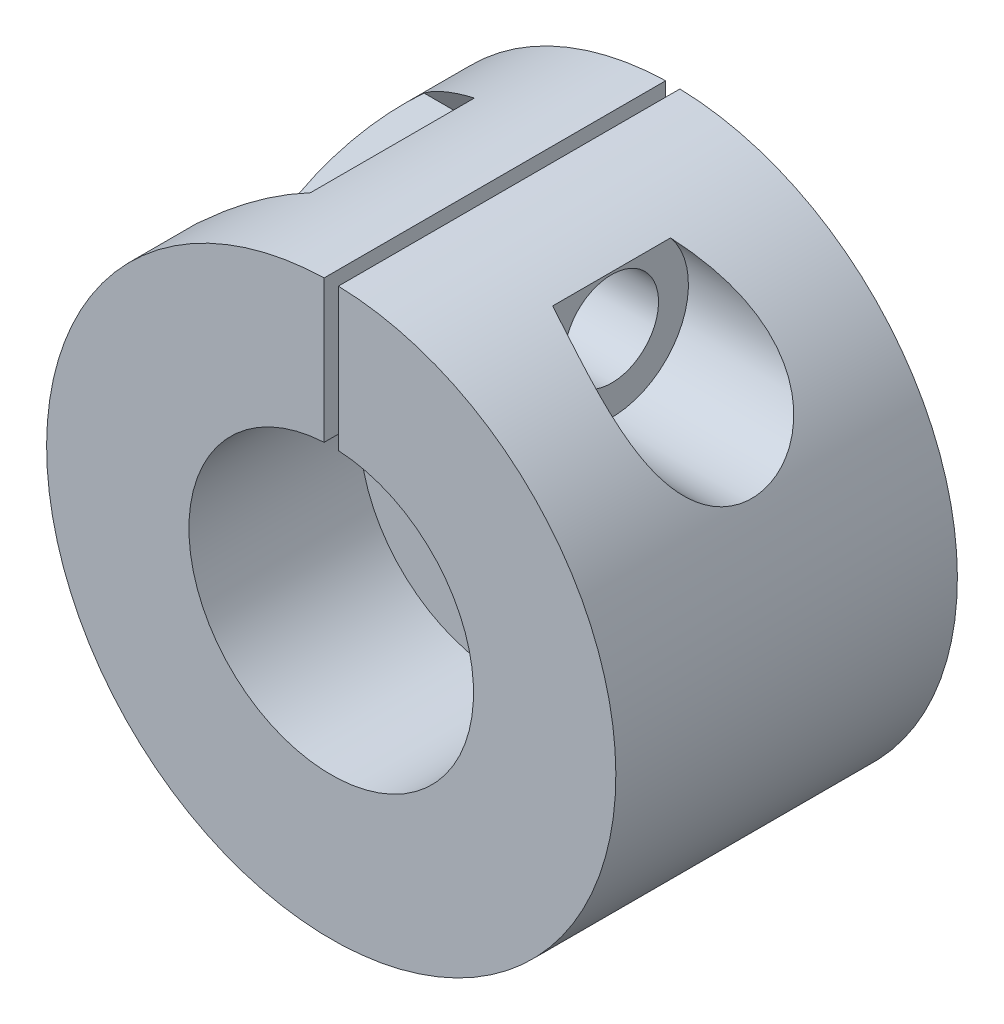
ISO-10303-21;
HEADER;
FILE_DESCRIPTION(('STEP AP214'),'2;1');
FILE_NAME('part.step','',(''),(''),'','','');
FILE_SCHEMA(('AUTOMOTIVE_DESIGN { 1 0 10303 214 1 1 1 1 }'));
ENDSEC;
DATA;
#1=APPLICATION_CONTEXT('core data for automotive mechanical design processes');
#2=APPLICATION_PROTOCOL_DEFINITION('international standard','automotive_design',2000,#1);
#3=PRODUCT_CONTEXT('',#1,'mechanical');
#4=PRODUCT('Part','Part','',(#3));
#5=PRODUCT_RELATED_PRODUCT_CATEGORY('part','',(#4));
#6=PRODUCT_DEFINITION_FORMATION('','',#4);
#7=PRODUCT_DEFINITION_CONTEXT('part definition',#1,'design');
#8=PRODUCT_DEFINITION('design','',#6,#7);
#9=PRODUCT_DEFINITION_SHAPE('','',#8);
#10=(LENGTH_UNIT() NAMED_UNIT(*) SI_UNIT(.MILLI.,.METRE.));
#11=(NAMED_UNIT(*) PLANE_ANGLE_UNIT() SI_UNIT($,.RADIAN.));
#12=(NAMED_UNIT(*) SI_UNIT($,.STERADIAN.) SOLID_ANGLE_UNIT());
#13=UNCERTAINTY_MEASURE_WITH_UNIT(LENGTH_MEASURE(1.E-05),#10,'distance_accuracy_value','');
#14=(GEOMETRIC_REPRESENTATION_CONTEXT(3) GLOBAL_UNCERTAINTY_ASSIGNED_CONTEXT((#13)) GLOBAL_UNIT_ASSIGNED_CONTEXT((#10,
#11,#12)) REPRESENTATION_CONTEXT('',''));
#15=CARTESIAN_POINT('',(0.,0.,0.));
#16=DIRECTION('',(0.,0.,1.));
#17=DIRECTION('',(1.,0.,0.));
#18=AXIS2_PLACEMENT_3D('',#15,#16,#17);
#19=CARTESIAN_POINT('',(0.,0.,15.24));
#20=DIRECTION('',(0.,0.,-1.));
#21=DIRECTION('',(-1.,0.,0.));
#22=AXIS2_PLACEMENT_3D('',#19,#20,#21);
#23=CYLINDRICAL_SURFACE('',#22,12.7);
#24=DIRECTION('',(0.,0.,-1.));
#25=VECTOR('',#24,1.);
#26=CARTESIAN_POINT('',(-11.5623208619439,5.25383062968895,15.24));
#27=LINE('',#26,#25);
#28=CARTESIAN_POINT('',(-11.5623208619439,5.25383062968895,10.083669068686));
#29=VERTEX_POINT('',#28);
#30=CARTESIAN_POINT('',(-11.5623208619439,5.25383062968895,5.15633093131403));
#31=VERTEX_POINT('',#30);
#32=EDGE_CURVE('E48',#29,#31,#27,.T.);
#33=ORIENTED_EDGE('',*,*,#32,.T.);
#34=CARTESIAN_POINT('',(0.,0.,8.18963145964165));
#35=DIRECTION('',(0.,-0.5,-0.866025403784438));
#36=DIRECTION('',(0.,0.866025403784439,-0.5));
#37=AXIS2_PLACEMENT_3D('',#34,#35,#36);
#38=ELLIPSE('',#37,14.6646968374165,12.7);
#39=CARTESIAN_POINT('',(-8.40475911305761,9.52103062968895,2.69266186262806));
#40=VERTEX_POINT('',#39);
#41=EDGE_CURVE('E11',#31,#40,#38,.T.);
#42=ORIENTED_EDGE('',*,*,#41,.T.);
#43=CARTESIAN_POINT('',(0.,0.,-2.80430773438554));
#44=DIRECTION('',(0.,0.5,-0.866025403784438));
#45=DIRECTION('',(0.,-0.866025403784439,-0.5));
#46=AXIS2_PLACEMENT_3D('',#43,#44,#45);
#47=ELLIPSE('',#46,14.6646968374165,12.7);
#48=CARTESIAN_POINT('',(-4.8895,11.7210404721595,3.96283813739823));
#49=VERTEX_POINT('',#48);
#50=EDGE_CURVE('E135',#40,#49,#47,.T.);
#51=ORIENTED_EDGE('',*,*,#50,.T.);
#52=DIRECTION('',(0.,0.,-1.));
#53=VECTOR('',#52,1.);
#54=CARTESIAN_POINT('',(-4.8895,11.7210404721595,15.24));
#55=LINE('',#54,#53);
#56=CARTESIAN_POINT('',(-4.8895,11.7210404721595,11.2771618626018));
#57=VERTEX_POINT('',#56);
#58=EDGE_CURVE('E148',#49,#57,#55,.F.);
#59=ORIENTED_EDGE('',*,*,#58,.T.);
#60=CARTESIAN_POINT('',(0.,0.,18.0443077343855));
#61=DIRECTION('',(0.,0.5,0.866025403784438));
#62=DIRECTION('',(0.,0.866025403784439,-0.5));
#63=AXIS2_PLACEMENT_3D('',#60,#61,#62);
#64=ELLIPSE('',#63,14.6646968374165,12.7);
#65=CARTESIAN_POINT('',(-8.40475911305761,9.52103062968895,12.5473381373719));
#66=VERTEX_POINT('',#65);
#67=EDGE_CURVE('E367',#57,#66,#64,.T.);
#68=ORIENTED_EDGE('',*,*,#67,.T.);
#69=CARTESIAN_POINT('',(0.,0.,7.05036854035835));
#70=DIRECTION('',(0.,-0.5,0.866025403784438));
#71=DIRECTION('',(0.,-0.866025403784438,-0.5));
#72=AXIS2_PLACEMENT_3D('',#69,#70,#71);
#73=ELLIPSE('',#72,14.6646968374165,12.7);
#74=EDGE_CURVE('E370',#66,#29,#73,.T.);
#75=ORIENTED_EDGE('',*,*,#74,.T.);
#76=EDGE_LOOP('',(#33,#42,#51,#59,#68,#75));
#77=FACE_BOUND('',#76,.T.);
#78=DIRECTION('',(0.,0.,-1.));
#79=VECTOR('',#78,1.);
#80=CARTESIAN_POINT('',(4.8895,11.7210404721595,15.24));
#81=LINE('',#80,#79);
#82=CARTESIAN_POINT('',(4.8895,11.7210404721595,10.2502086786095));
#83=VERTEX_POINT('',#82);
#84=CARTESIAN_POINT('',(4.8895,11.7210404721595,4.98979132139046));
#85=VERTEX_POINT('',#84);
#86=EDGE_CURVE('E178',#83,#85,#81,.T.);
#87=ORIENTED_EDGE('',*,*,#86,.T.);
#88=CARTESIAN_POINT('',(4.8895,11.7210404721595,4.98979132139047));
#89=CARTESIAN_POINT('',(5.14238159479776,11.6155378420201,4.90157651494984));
#90=CARTESIAN_POINT('',(5.39308389032257,11.5013576712272,4.81684363667059));
#91=CARTESIAN_POINT('',(5.89014783145619,11.2549312086779,4.65803034717835));
#92=CARTESIAN_POINT('',(6.13648979791708,11.1226191174049,4.58399084950643));
#93=CARTESIAN_POINT('',(6.62642102503,10.8379847556756,4.45002189206422));
#94=CARTESIAN_POINT('',(6.86992086999459,10.6854039307741,4.3903088117292));
#95=CARTESIAN_POINT('',(7.34852553657174,10.3620610580789,4.29145057329817));
#96=CARTESIAN_POINT('',(7.58364417036977,10.1913309639781,4.25226996405209));
#97=CARTESIAN_POINT('',(7.93303525523491,9.91866961084558,4.21283123604913));
#98=CARTESIAN_POINT('',(8.05117565176498,9.82302109285119,4.20291795176991));
#99=CARTESIAN_POINT('',(8.28420763722012,9.62730673984792,4.19124518152161));
#100=CARTESIAN_POINT('',(8.39909903774156,9.52724064952992,4.18948616744476));
#101=CARTESIAN_POINT('',(8.62466963831202,9.32352327037322,4.1951823688543));
#102=CARTESIAN_POINT('',(8.73536292737595,9.21988671553529,4.20260330559498));
#103=CARTESIAN_POINT('',(8.95237309490112,9.0093204644907,4.22773941609644));
#104=CARTESIAN_POINT('',(9.05869077192099,8.90239137546174,4.24545270248012));
#105=CARTESIAN_POINT('',(9.2491890571501,8.70391828328022,4.2884968273324));
#106=CARTESIAN_POINT('',(9.3341356468588,8.61273477705542,4.3120967368714));
#107=CARTESIAN_POINT('',(9.50002182747443,8.42940453214513,4.36798891961584));
#108=CARTESIAN_POINT('',(9.5809623025272,8.3372580114823,4.40027926463137));
#109=CARTESIAN_POINT('',(9.73833696283624,8.15288073587676,4.47419990036315));
#110=CARTESIAN_POINT('',(9.81477272774282,8.06065002211803,4.51582689212573));
#111=CARTESIAN_POINT('',(9.96260730555212,7.8772055112651,4.60894042197619));
#112=CARTESIAN_POINT('',(10.0340072298087,7.78599149356223,4.66042477527917));
#113=CARTESIAN_POINT('',(10.2125699138797,7.55156361165428,4.80785021391288));
#114=CARTESIAN_POINT('',(10.3154751470015,7.40999984177046,4.91192706359034));
#115=CARTESIAN_POINT('',(10.4575115434693,7.20675956738354,5.08814769687737));
#116=CARTESIAN_POINT('',(10.5028188207455,7.14050611676664,5.15026718305753));
#117=CARTESIAN_POINT('',(10.5891429070966,7.01184882861304,5.28110139218578));
#118=CARTESIAN_POINT('',(10.6301617985014,6.9494431288037,5.34981288285088));
#119=CARTESIAN_POINT('',(10.7079853069349,6.82892682159748,5.49408449495294));
#120=CARTESIAN_POINT('',(10.7447590136293,6.77084869089552,5.56968845107599));
#121=CARTESIAN_POINT('',(10.8135938455054,6.6603620514393,5.72689672421234));
#122=CARTESIAN_POINT('',(10.8456571332917,6.60795094382916,5.80849826169067));
#123=CARTESIAN_POINT('',(10.904969348353,6.50960399814713,5.9771727303747));
#124=CARTESIAN_POINT('',(10.9322184321144,6.46366794961206,6.06424548361276));
#125=CARTESIAN_POINT('',(10.9818205353506,6.37903021447655,6.24316841987484));
#126=CARTESIAN_POINT('',(11.0041741342385,6.34032767182214,6.33501803593126));
#127=CARTESIAN_POINT('',(11.041744194892,6.27464377137506,6.51232619544949));
#128=CARTESIAN_POINT('',(11.0574759097581,6.24684045037194,6.59737233184051));
#129=CARTESIAN_POINT('',(11.0850155954977,6.19783993691063,6.77000126936382));
#130=CARTESIAN_POINT('',(11.0968222698994,6.17664492737329,6.85758489828552));
#131=CARTESIAN_POINT('',(11.1164883942662,6.14118074940907,7.03452050619283));
#132=CARTESIAN_POINT('',(11.1243506281873,6.12690669646313,7.12387119157595));
#133=CARTESIAN_POINT('',(11.1361411020666,6.10544826571359,7.3036854824399));
#134=CARTESIAN_POINT('',(11.1400679333319,6.09826642660956,7.39414947471233));
#135=CARTESIAN_POINT('',(11.1457036234476,6.0879752617976,7.65550952413232));
#136=CARTESIAN_POINT('',(11.142404132655,6.0940399148083,7.8269957269253));
#137=CARTESIAN_POINT('',(11.1218272436794,6.13150716150028,8.16619639821076));
#138=CARTESIAN_POINT('',(11.1045520734253,6.16290571658247,8.33391146349849));
#139=CARTESIAN_POINT('',(11.0562321567457,6.24917077151799,8.65978966589859));
#140=CARTESIAN_POINT('',(11.0252877526868,6.30386615254241,8.81801303818298));
#141=CARTESIAN_POINT('',(10.949790343869,6.43410632051461,9.12210336225755));
#142=CARTESIAN_POINT('',(10.9052367170642,6.50965206046846,9.26796974884935));
#143=CARTESIAN_POINT('',(10.8012083357712,6.68088435009802,9.54859961111896));
#144=CARTESIAN_POINT('',(10.7412963098073,6.77714491408201,9.68284920657144));
#145=CARTESIAN_POINT('',(10.6080615726868,6.98384771218797,9.93236257276186));
#146=CARTESIAN_POINT('',(10.5347356620145,7.09429332788988,10.0476218013737));
#147=CARTESIAN_POINT('',(10.3689004937249,7.33477917301391,10.2670879181629));
#148=CARTESIAN_POINT('',(10.2752853264894,7.46568753765836,10.3694990577714));
#149=CARTESIAN_POINT('',(10.0750987581429,7.73371599007902,10.5508306510212));
#150=CARTESIAN_POINT('',(9.96851963233054,7.87083975053174,10.6297370015812));
#151=CARTESIAN_POINT('',(9.77430909297078,8.10986494180957,10.7471952499465));
#152=CARTESIAN_POINT('',(9.68923183957235,8.21138001936601,10.7908959028506));
#153=CARTESIAN_POINT('',(9.51376712855669,8.41404721184828,10.8672069301116));
#154=CARTESIAN_POINT('',(9.42337773299305,8.51519917984714,10.8998132272624));
#155=CARTESIAN_POINT('',(9.23785848797224,8.71611715855861,10.9548195560698));
#156=CARTESIAN_POINT('',(9.14272296136255,8.815881317608,10.9772070230622));
#157=CARTESIAN_POINT('',(8.94837566032418,9.01308810493386,11.0126501752606));
#158=CARTESIAN_POINT('',(8.84916267518507,9.11053002990626,11.0257030672915));
#159=CARTESIAN_POINT('',(8.60327507022835,9.3441728715736,11.0472269510711));
#160=CARTESIAN_POINT('',(8.45471571344509,9.47881031114163,11.051240014344));
#161=CARTESIAN_POINT('',(8.1515718417328,9.74074258912694,11.0444627748009));
#162=CARTESIAN_POINT('',(7.99698448307468,9.86803389000661,11.0336654009814));
#163=CARTESIAN_POINT('',(7.68232777508925,10.1149380509837,10.9994819737951));
#164=CARTESIAN_POINT('',(7.52224151414851,10.2345232173586,10.9760530745343));
#165=CARTESIAN_POINT('',(7.19794920423795,10.4651382584145,10.9186088645083));
#166=CARTESIAN_POINT('',(7.03374389581494,10.5761696565351,10.8845954443262));
#167=CARTESIAN_POINT('',(6.70754174726278,10.7858788059942,10.8090731806906));
#168=CARTESIAN_POINT('',(6.54566343356883,10.884850227904,10.7678626287065));
#169=CARTESIAN_POINT('',(6.2190520947139,11.0747043550815,10.6786175901254));
#170=CARTESIAN_POINT('',(6.05431863049795,11.1655858028775,10.630582045682));
#171=CARTESIAN_POINT('',(5.72411778973097,11.3383791624212,10.5295013871728));
#172=CARTESIAN_POINT('',(5.55867666601376,11.4203758796445,10.4765147203313));
#173=CARTESIAN_POINT('',(5.22566060438949,11.5765384717977,10.3662793179787));
#174=CARTESIAN_POINT('',(5.05808701362243,11.6507090398854,10.3090331723069));
#175=CARTESIAN_POINT('',(4.8895,11.7210404721595,10.2502086786095));
#176=B_SPLINE_CURVE_WITH_KNOTS('',3,(#88,#89,#90,#91,#92,#93,#94,#95,#96,#97,#98,#99,#100,#101,
#102,#103,#104,#105,#106,#107,#108,#109,#110,#111,#112,#113,#114,#115,#116,#117,#118,#119,#120,
#121,#122,#123,#124,#125,#126,#127,#128,#129,#130,#131,#132,#133,#134,#135,#136,#137,#138,#139,
#140,#141,#142,#143,#144,#145,#146,#147,#148,#149,#150,#151,#152,#153,#154,#155,#156,#157,#158,
#159,#160,#161,#162,#163,#164,#165,#166,#167,#168,#169,#170,#171,#172,#173,#174,#175),
.UNSPECIFIED.,.F.,.F.,(4,2,2,2,2,2,2,2,2,2,2,2,2,2,2,2,2,2,2,2,2,2,2,2,2,2,2,2,2,2,2,2,2,2,2,2,
2,2,2,2,2,2,2,4),(0.,0.863719340341155,1.73066042721221,2.60997021523415,3.48775675205787,
3.94448310042033,4.40123587946431,4.85628823987739,5.31125718061348,5.69143396625997,
6.07152646964346,6.45148488444192,6.83135918256839,7.43924368596816,7.74342522029639,
8.04745835909528,8.35358162484506,8.65956390387656,8.96553623506674,9.27147233280182,
9.54366606811699,9.81594962205034,10.0880407290126,10.3602291973171,10.8724081674794,
11.3845055048587,11.8929045679958,12.4013268723469,12.9262473098371,13.4512931163897,
14.021370153646,14.5917885563649,15.0096759275764,15.4277167080824,15.8462701192805,
16.2649487214287,16.8656176750867,17.4665735082583,18.0695807160389,18.6724802778039,
19.2546279101856,19.8368658717298,20.4129370843937,20.988660853491),.UNSPECIFIED.);
#177=EDGE_CURVE('E246',#85,#83,#176,.T.);
#178=ORIENTED_EDGE('',*,*,#177,.T.);
#179=EDGE_LOOP('',(#87,#178));
#180=FACE_BOUND('',#179,.T.);
#181=CARTESIAN_POINT('',(0.,0.,15.24));
#182=DIRECTION('',(0.,0.,1.));
#183=DIRECTION('',(1.,0.,0.));
#184=AXIS2_PLACEMENT_3D('',#181,#182,#183);
#185=CIRCLE('',#184,12.7);
#186=CARTESIAN_POINT('',(-0.3175,12.6960306296889,15.24));
#187=VERTEX_POINT('',#186);
#188=CARTESIAN_POINT('',(0.3175,12.6960306296889,15.24));
#189=VERTEX_POINT('',#188);
#190=EDGE_CURVE('E242',#187,#189,#185,.T.);
#191=ORIENTED_EDGE('',*,*,#190,.F.);
#192=DIRECTION('',(0.,0.,-1.));
#193=VECTOR('',#192,1.);
#194=CARTESIAN_POINT('',(-0.3175,12.6960306296889,15.24));
#195=LINE('',#194,#193);
#196=CARTESIAN_POINT('',(-0.3175,12.6960306296889,0.));
#197=VERTEX_POINT('',#196);
#198=EDGE_CURVE('E196',#197,#187,#195,.F.);
#199=ORIENTED_EDGE('',*,*,#198,.F.);
#200=CARTESIAN_POINT('',(0.,0.,0.));
#201=DIRECTION('',(0.,0.,1.));
#202=DIRECTION('',(1.,0.,0.));
#203=AXIS2_PLACEMENT_3D('',#200,#201,#202);
#204=CIRCLE('',#203,12.7);
#205=CARTESIAN_POINT('',(0.3175,12.6960306296889,0.));
#206=VERTEX_POINT('',#205);
#207=EDGE_CURVE('E241',#197,#206,#204,.T.);
#208=ORIENTED_EDGE('',*,*,#207,.T.);
#209=DIRECTION('',(0.,0.,-1.));
#210=VECTOR('',#209,1.);
#211=CARTESIAN_POINT('',(0.3175,12.6960306296889,15.24));
#212=LINE('',#211,#210);
#213=EDGE_CURVE('E193',#189,#206,#212,.T.);
#214=ORIENTED_EDGE('',*,*,#213,.F.);
#215=EDGE_LOOP('',(#191,#199,#208,#214));
#216=FACE_BOUND('',#215,.T.);
#217=ADVANCED_FACE('F39',(#77,#180,#216),#23,.T.);
#218=CARTESIAN_POINT('',(0.,0.,15.24));
#219=DIRECTION('',(0.,0.,1.));
#220=DIRECTION('',(1.,0.,0.));
#221=AXIS2_PLACEMENT_3D('',#218,#219,#220);
#222=PLANE('',#221);
#223=DIRECTION('',(0.,1.,0.));
#224=VECTOR('',#223,1.);
#225=CARTESIAN_POINT('',(-0.3175,-0.635000000000001,15.24));
#226=LINE('',#225,#224);
#227=CARTESIAN_POINT('',(-0.3175,6.34205753285162,15.24));
#228=VERTEX_POINT('',#227);
#229=EDGE_CURVE('E205',#228,#187,#226,.T.);
#230=ORIENTED_EDGE('',*,*,#229,.T.);
#231=ORIENTED_EDGE('',*,*,#190,.T.);
#232=DIRECTION('',(0.,-1.,0.));
#233=VECTOR('',#232,1.);
#234=CARTESIAN_POINT('',(0.3175,-0.635000000000001,15.24));
#235=LINE('',#234,#233);
#236=CARTESIAN_POINT('',(0.3175,6.34205753285162,15.24));
#237=VERTEX_POINT('',#236);
#238=EDGE_CURVE('E221',#189,#237,#235,.T.);
#239=ORIENTED_EDGE('',*,*,#238,.T.);
#240=CARTESIAN_POINT('',(0.,0.,15.24));
#241=DIRECTION('',(0.,0.,1.));
#242=DIRECTION('',(1.,0.,0.));
#243=AXIS2_PLACEMENT_3D('',#240,#241,#242);
#244=CIRCLE('',#243,6.35);
#245=EDGE_CURVE('E225',#228,#237,#244,.T.);
#246=ORIENTED_EDGE('',*,*,#245,.F.);
#247=EDGE_LOOP('',(#230,#231,#239,#246));
#248=FACE_BOUND('',#247,.T.);
#249=ADVANCED_FACE('F299',(#248),#222,.T.);
#250=CARTESIAN_POINT('',(0.,0.,0.));
#251=DIRECTION('',(0.,0.,1.));
#252=DIRECTION('',(1.,0.,0.));
#253=AXIS2_PLACEMENT_3D('',#250,#251,#252);
#254=PLANE('',#253);
#255=ORIENTED_EDGE('',*,*,#207,.F.);
#256=DIRECTION('',(0.,1.,0.));
#257=VECTOR('',#256,1.);
#258=CARTESIAN_POINT('',(-0.3175,-0.635000000000001,0.));
#259=LINE('',#258,#257);
#260=CARTESIAN_POINT('',(-0.3175,2.96756364716917,0.));
#261=VERTEX_POINT('',#260);
#262=EDGE_CURVE('E209',#261,#197,#259,.T.);
#263=ORIENTED_EDGE('',*,*,#262,.F.);
#264=CARTESIAN_POINT('',(0.,0.,0.));
#265=DIRECTION('',(0.,0.,-1.));
#266=DIRECTION('',(-1.,0.,0.));
#267=AXIS2_PLACEMENT_3D('',#264,#265,#266);
#268=CIRCLE('',#267,2.9845);
#269=CARTESIAN_POINT('',(0.3175,2.96756364716917,0.));
#270=VERTEX_POINT('',#269);
#271=EDGE_CURVE('E237',#270,#261,#268,.T.);
#272=ORIENTED_EDGE('',*,*,#271,.F.);
#273=DIRECTION('',(0.,-1.,0.));
#274=VECTOR('',#273,1.);
#275=CARTESIAN_POINT('',(0.3175,-0.635000000000001,0.));
#276=LINE('',#275,#274);
#277=EDGE_CURVE('E212',#206,#270,#276,.T.);
#278=ORIENTED_EDGE('',*,*,#277,.F.);
#279=EDGE_LOOP('',(#255,#263,#272,#278));
#280=FACE_BOUND('',#279,.T.);
#281=ADVANCED_FACE('F297',(#280),#254,.F.);
#282=CARTESIAN_POINT('',(0.,0.,7.62));
#283=DIRECTION('',(0.,0.,-1.));
#284=DIRECTION('',(-1.,0.,0.));
#285=AXIS2_PLACEMENT_3D('',#282,#283,#284);
#286=CYLINDRICAL_SURFACE('',#285,2.9845);
#287=ORIENTED_EDGE('',*,*,#271,.T.);
#288=DIRECTION('',(0.,0.,-1.));
#289=VECTOR('',#288,1.);
#290=CARTESIAN_POINT('',(-0.3175,2.96756364716917,7.62));
#291=LINE('',#290,#289);
#292=CARTESIAN_POINT('',(-0.3175,2.96756364716917,7.62));
#293=VERTEX_POINT('',#292);
#294=EDGE_CURVE('E190',#293,#261,#291,.T.);
#295=ORIENTED_EDGE('',*,*,#294,.F.);
#296=CARTESIAN_POINT('',(0.,0.,7.62));
#297=DIRECTION('',(0.,0.,-1.));
#298=DIRECTION('',(-1.,0.,0.));
#299=AXIS2_PLACEMENT_3D('',#296,#297,#298);
#300=CIRCLE('',#299,2.9845);
#301=CARTESIAN_POINT('',(0.3175,2.96756364716917,7.62));
#302=VERTEX_POINT('',#301);
#303=EDGE_CURVE('E233',#302,#293,#300,.T.);
#304=ORIENTED_EDGE('',*,*,#303,.F.);
#305=DIRECTION('',(0.,0.,-1.));
#306=VECTOR('',#305,1.);
#307=CARTESIAN_POINT('',(0.3175,2.96756364716917,7.62));
#308=LINE('',#307,#306);
#309=EDGE_CURVE('E187',#270,#302,#308,.F.);
#310=ORIENTED_EDGE('',*,*,#309,.F.);
#311=EDGE_LOOP('',(#287,#295,#304,#310));
#312=FACE_BOUND('',#311,.T.);
#313=ADVANCED_FACE('F293',(#312),#286,.F.);
#314=CARTESIAN_POINT('',(0.,0.,7.62));
#315=DIRECTION('',(0.,0.,-1.));
#316=DIRECTION('',(-1.,0.,0.));
#317=AXIS2_PLACEMENT_3D('',#314,#315,#316);
#318=PLANE('',#317);
#319=ORIENTED_EDGE('',*,*,#303,.T.);
#320=DIRECTION('',(0.,-1.,0.));
#321=VECTOR('',#320,1.);
#322=CARTESIAN_POINT('',(-0.3175,-0.635000000000001,7.62));
#323=LINE('',#322,#321);
#324=CARTESIAN_POINT('',(-0.3175,6.34205753285162,7.62));
#325=VERTEX_POINT('',#324);
#326=EDGE_CURVE('E202',#325,#293,#323,.T.);
#327=ORIENTED_EDGE('',*,*,#326,.F.);
#328=CARTESIAN_POINT('',(0.,0.,7.62));
#329=DIRECTION('',(0.,0.,-1.));
#330=DIRECTION('',(-1.,0.,0.));
#331=AXIS2_PLACEMENT_3D('',#328,#329,#330);
#332=CIRCLE('',#331,6.35);
#333=CARTESIAN_POINT('',(0.3175,6.34205753285162,7.62));
#334=VERTEX_POINT('',#333);
#335=EDGE_CURVE('E229',#325,#334,#332,.F.);
#336=ORIENTED_EDGE('',*,*,#335,.T.);
#337=DIRECTION('',(0.,1.,0.));
#338=VECTOR('',#337,1.);
#339=CARTESIAN_POINT('',(0.3175,-0.635000000000001,7.62));
#340=LINE('',#339,#338);
#341=EDGE_CURVE('E218',#302,#334,#340,.T.);
#342=ORIENTED_EDGE('',*,*,#341,.F.);
#343=EDGE_LOOP('',(#319,#327,#336,#342));
#344=FACE_BOUND('',#343,.T.);
#345=ADVANCED_FACE('F289',(#344),#318,.F.);
#346=CARTESIAN_POINT('',(0.,0.,-10.3405122421383));
#347=DIRECTION('',(0.,0.,1.));
#348=DIRECTION('',(1.,0.,0.));
#349=AXIS2_PLACEMENT_3D('',#346,#347,#348);
#350=CYLINDRICAL_SURFACE('',#349,6.35);
#351=ORIENTED_EDGE('',*,*,#335,.F.);
#352=DIRECTION('',(0.,0.,1.));
#353=VECTOR('',#352,1.);
#354=CARTESIAN_POINT('',(-0.3175,6.34205753285162,-10.3405122421383));
#355=LINE('',#354,#353);
#356=EDGE_CURVE('E199',#228,#325,#355,.F.);
#357=ORIENTED_EDGE('',*,*,#356,.F.);
#358=ORIENTED_EDGE('',*,*,#245,.T.);
#359=DIRECTION('',(0.,0.,1.));
#360=VECTOR('',#359,1.);
#361=CARTESIAN_POINT('',(0.3175,6.34205753285162,-10.3405122421383));
#362=LINE('',#361,#360);
#363=EDGE_CURVE('E215',#334,#237,#362,.T.);
#364=ORIENTED_EDGE('',*,*,#363,.F.);
#365=EDGE_LOOP('',(#351,#357,#358,#364));
#366=FACE_BOUND('',#365,.T.);
#367=ADVANCED_FACE('F282',(#366),#350,.F.);
#368=CARTESIAN_POINT('',(0.3175,-0.635000000000001,15.241));
#369=DIRECTION('',(1.,0.,0.));
#370=DIRECTION('',(0.,0.,-1.));
#371=AXIS2_PLACEMENT_3D('',#368,#369,#370);
#372=PLANE('',#371);
#373=CARTESIAN_POINT('',(0.3175,9.52103062968895,7.62));
#374=DIRECTION('',(1.,0.,0.));
#375=DIRECTION('',(0.,0.,-1.));
#376=AXIS2_PLACEMENT_3D('',#373,#374,#375);
#377=CIRCLE('',#376,2.0955);
#378=CARTESIAN_POINT('',(0.3175,9.52103062968895,5.5245));
#379=VERTEX_POINT('',#378);
#380=EDGE_CURVE('E183',#379,#379,#377,.T.);
#381=ORIENTED_EDGE('',*,*,#380,.T.);
#382=EDGE_LOOP('',(#381));
#383=FACE_BOUND('',#382,.T.);
#384=ORIENTED_EDGE('',*,*,#213,.T.);
#385=ORIENTED_EDGE('',*,*,#277,.T.);
#386=ORIENTED_EDGE('',*,*,#309,.T.);
#387=ORIENTED_EDGE('',*,*,#341,.T.);
#388=ORIENTED_EDGE('',*,*,#363,.T.);
#389=ORIENTED_EDGE('',*,*,#238,.F.);
#390=EDGE_LOOP('',(#384,#385,#386,#387,#388,#389));
#391=FACE_BOUND('',#390,.T.);
#392=ADVANCED_FACE('F278',(#383,#391),#372,.F.);
#393=CARTESIAN_POINT('',(-0.3175,-0.635000000000001,15.241));
#394=DIRECTION('',(-1.,0.,0.));
#395=DIRECTION('',(0.,0.,1.));
#396=AXIS2_PLACEMENT_3D('',#393,#394,#395);
#397=PLANE('',#396);
#398=CARTESIAN_POINT('',(-0.3175,9.52103062968895,7.62));
#399=DIRECTION('',(-1.,0.,0.));
#400=DIRECTION('',(0.,0.,1.));
#401=AXIS2_PLACEMENT_3D('',#398,#399,#400);
#402=CIRCLE('',#401,2.0955);
#403=CARTESIAN_POINT('',(-0.3175,9.52103062968895,9.7155));
#404=VERTEX_POINT('',#403);
#405=EDGE_CURVE('E182',#404,#404,#402,.T.);
#406=ORIENTED_EDGE('',*,*,#405,.T.);
#407=EDGE_LOOP('',(#406));
#408=FACE_BOUND('',#407,.T.);
#409=ORIENTED_EDGE('',*,*,#198,.T.);
#410=ORIENTED_EDGE('',*,*,#229,.F.);
#411=ORIENTED_EDGE('',*,*,#356,.T.);
#412=ORIENTED_EDGE('',*,*,#326,.T.);
#413=ORIENTED_EDGE('',*,*,#294,.T.);
#414=ORIENTED_EDGE('',*,*,#262,.T.);
#415=EDGE_LOOP('',(#409,#410,#411,#412,#413,#414));
#416=FACE_BOUND('',#415,.T.);
#417=ADVANCED_FACE('F281',(#408,#416),#397,.F.);
#418=CARTESIAN_POINT('',(12.7,9.52103062968895,7.62));
#419=DIRECTION('',(-1.,0.,0.));
#420=DIRECTION('',(0.,0.,1.));
#421=AXIS2_PLACEMENT_3D('',#418,#419,#420);
#422=CYLINDRICAL_SURFACE('',#421,2.0955);
#423=CARTESIAN_POINT('',(-4.8895,9.52103062968895,7.62));
#424=DIRECTION('',(1.,0.,0.));
#425=DIRECTION('',(0.,0.,-1.));
#426=AXIS2_PLACEMENT_3D('',#423,#424,#425);
#427=CIRCLE('',#426,2.0955);
#428=CARTESIAN_POINT('',(-4.8895,9.52103062968895,5.5245));
#429=VERTEX_POINT('',#428);
#430=EDGE_CURVE('E167',#429,#429,#427,.F.);
#431=ORIENTED_EDGE('',*,*,#430,.T.);
#432=EDGE_LOOP('',(#431));
#433=FACE_BOUND('',#432,.T.);
#434=ORIENTED_EDGE('',*,*,#405,.F.);
#435=EDGE_LOOP('',(#434));
#436=FACE_BOUND('',#435,.T.);
#437=ADVANCED_FACE('F276',(#433,#436),#422,.F.);
#438=CARTESIAN_POINT('',(4.8895,9.52103062968895,7.62));
#439=DIRECTION('',(-1.,0.,0.));
#440=DIRECTION('',(0.,0.,1.));
#441=AXIS2_PLACEMENT_3D('',#438,#439,#440);
#442=CIRCLE('',#441,2.0955);
#443=CARTESIAN_POINT('',(4.8895,9.52103062968895,9.7155));
#444=VERTEX_POINT('',#443);
#445=EDGE_CURVE('E177',#444,#444,#442,.F.);
#446=ORIENTED_EDGE('',*,*,#445,.T.);
#447=EDGE_LOOP('',(#446));
#448=FACE_BOUND('',#447,.T.);
#449=ORIENTED_EDGE('',*,*,#380,.F.);
#450=EDGE_LOOP('',(#449));
#451=FACE_BOUND('',#450,.T.);
#452=ADVANCED_FACE('F271',(#448,#451),#422,.F.);
#453=CARTESIAN_POINT('',(12.5095,9.52103062968895,7.62));
#454=DIRECTION('',(-1.,0.,0.));
#455=DIRECTION('',(0.,0.,1.));
#456=AXIS2_PLACEMENT_3D('',#453,#454,#455);
#457=CYLINDRICAL_SURFACE('',#456,3.429);
#458=CARTESIAN_POINT('',(4.8895,9.52103062968895,7.62));
#459=DIRECTION('',(-1.,0.,0.));
#460=DIRECTION('',(0.,0.,1.));
#461=AXIS2_PLACEMENT_3D('',#458,#459,#460);
#462=CIRCLE('',#461,3.429);
#463=EDGE_CURVE('E62',#85,#83,#462,.T.);
#464=ORIENTED_EDGE('',*,*,#463,.T.);
#465=ORIENTED_EDGE('',*,*,#177,.F.);
#466=EDGE_LOOP('',(#464,#465));
#467=FACE_BOUND('',#466,.T.);
#468=ADVANCED_FACE('F265',(#467),#457,.F.);
#469=CARTESIAN_POINT('',(4.8895,9.52103062968895,7.62));
#470=DIRECTION('',(-1.,0.,0.));
#471=DIRECTION('',(0.,0.,1.));
#472=AXIS2_PLACEMENT_3D('',#469,#470,#471);
#473=PLANE('',#472);
#474=ORIENTED_EDGE('',*,*,#445,.F.);
#475=EDGE_LOOP('',(#474));
#476=FACE_BOUND('',#475,.T.);
#477=ORIENTED_EDGE('',*,*,#463,.F.);
#478=ORIENTED_EDGE('',*,*,#86,.F.);
#479=EDGE_LOOP('',(#477,#478));
#480=FACE_BOUND('',#479,.T.);
#481=ADVANCED_FACE('F270',(#476,#480),#473,.F.);
#482=CARTESIAN_POINT('',(-12.7,5.25383062968895,5.15633093131403));
#483=DIRECTION('',(0.,-0.5,-0.866025403784438));
#484=DIRECTION('',(0.,0.866025403784439,-0.5));
#485=AXIS2_PLACEMENT_3D('',#482,#483,#484);
#486=PLANE('',#485);
#487=DIRECTION('',(1.,0.,0.));
#488=VECTOR('',#487,1.);
#489=CARTESIAN_POINT('',(-12.7,5.25383062968895,5.15633093131403));
#490=LINE('',#489,#488);
#491=CARTESIAN_POINT('',(-4.8895,5.25383062968895,5.15633093131403));
#492=VERTEX_POINT('',#491);
#493=EDGE_CURVE('E153',#31,#492,#490,.T.);
#494=ORIENTED_EDGE('',*,*,#493,.T.);
#495=DIRECTION('',(0.,0.866025403784438,-0.5));
#496=VECTOR('',#495,1.);
#497=CARTESIAN_POINT('',(-4.8895,5.25383062968895,5.15633093131403));
#498=LINE('',#497,#496);
#499=CARTESIAN_POINT('',(-4.8895,9.52103062968895,2.69266186262806));
#500=VERTEX_POINT('',#499);
#501=EDGE_CURVE('E145',#492,#500,#498,.T.);
#502=ORIENTED_EDGE('',*,*,#501,.T.);
#503=DIRECTION('',(1.,0.,0.));
#504=VECTOR('',#503,1.);
#505=CARTESIAN_POINT('',(-12.7,9.52103062968895,2.69266186262806));
#506=LINE('',#505,#504);
#507=EDGE_CURVE('E130',#40,#500,#506,.T.);
#508=ORIENTED_EDGE('',*,*,#507,.F.);
#509=ORIENTED_EDGE('',*,*,#41,.F.);
#510=EDGE_LOOP('',(#494,#502,#508,#509));
#511=FACE_BOUND('',#510,.T.);
#512=ADVANCED_FACE('F151',(#511),#486,.F.);
#513=CARTESIAN_POINT('',(-12.7,5.25383062968895,10.083669068686));
#514=DIRECTION('',(0.,-1.,0.));
#515=DIRECTION('',(0.,0.,-1.));
#516=AXIS2_PLACEMENT_3D('',#513,#514,#515);
#517=PLANE('',#516);
#518=DIRECTION('',(1.,0.,0.));
#519=VECTOR('',#518,1.);
#520=CARTESIAN_POINT('',(-12.7,5.25383062968895,10.083669068686));
#521=LINE('',#520,#519);
#522=CARTESIAN_POINT('',(-4.8895,5.25383062968895,10.083669068686));
#523=VERTEX_POINT('',#522);
#524=EDGE_CURVE('E168',#29,#523,#521,.T.);
#525=ORIENTED_EDGE('',*,*,#524,.T.);
#526=DIRECTION('',(0.,0.,-1.));
#527=VECTOR('',#526,1.);
#528=CARTESIAN_POINT('',(-4.8895,5.25383062968895,10.083669068686));
#529=LINE('',#528,#527);
#530=EDGE_CURVE('E140',#523,#492,#529,.T.);
#531=ORIENTED_EDGE('',*,*,#530,.T.);
#532=ORIENTED_EDGE('',*,*,#493,.F.);
#533=ORIENTED_EDGE('',*,*,#32,.F.);
#534=EDGE_LOOP('',(#525,#531,#532,#533));
#535=FACE_BOUND('',#534,.T.);
#536=ADVANCED_FACE('F337',(#535),#517,.F.);
#537=CARTESIAN_POINT('',(-12.7,9.52103062968895,12.5473381373719));
#538=DIRECTION('',(0.,-0.5,0.866025403784438));
#539=DIRECTION('',(0.,-0.866025403784438,-0.5));
#540=AXIS2_PLACEMENT_3D('',#537,#538,#539);
#541=PLANE('',#540);
#542=DIRECTION('',(1.,0.,0.));
#543=VECTOR('',#542,1.);
#544=CARTESIAN_POINT('',(-12.7,9.52103062968895,12.5473381373719));
#545=LINE('',#544,#543);
#546=CARTESIAN_POINT('',(-4.8895,9.52103062968895,12.5473381373719));
#547=VERTEX_POINT('',#546);
#548=EDGE_CURVE('E139',#66,#547,#545,.T.);
#549=ORIENTED_EDGE('',*,*,#548,.T.);
#550=DIRECTION('',(0.,-0.866025403784438,-0.5));
#551=VECTOR('',#550,1.);
#552=CARTESIAN_POINT('',(-4.8895,9.52103062968895,12.5473381373719));
#553=LINE('',#552,#551);
#554=EDGE_CURVE('E159',#547,#523,#553,.T.);
#555=ORIENTED_EDGE('',*,*,#554,.T.);
#556=ORIENTED_EDGE('',*,*,#524,.F.);
#557=ORIENTED_EDGE('',*,*,#74,.F.);
#558=EDGE_LOOP('',(#549,#555,#556,#557));
#559=FACE_BOUND('',#558,.T.);
#560=ADVANCED_FACE('F344',(#559),#541,.F.);
#561=CARTESIAN_POINT('',(-12.7,13.788230629689,10.083669068686));
#562=DIRECTION('',(0.,0.5,0.866025403784438));
#563=DIRECTION('',(0.,-0.866025403784439,0.5));
#564=AXIS2_PLACEMENT_3D('',#561,#562,#563);
#565=PLANE('',#564);
#566=DIRECTION('',(0.,-0.866025403784439,0.5));
#567=VECTOR('',#566,1.);
#568=CARTESIAN_POINT('',(-4.8895,13.788230629689,10.083669068686));
#569=LINE('',#568,#567);
#570=EDGE_CURVE('E55',#57,#547,#569,.T.);
#571=ORIENTED_EDGE('',*,*,#570,.T.);
#572=ORIENTED_EDGE('',*,*,#548,.F.);
#573=ORIENTED_EDGE('',*,*,#67,.F.);
#574=EDGE_LOOP('',(#571,#572,#573));
#575=FACE_BOUND('',#574,.T.);
#576=ADVANCED_FACE('F350',(#575),#565,.F.);
#577=CARTESIAN_POINT('',(-12.7,9.52103062968895,2.69266186262806));
#578=DIRECTION('',(0.,0.5,-0.866025403784438));
#579=DIRECTION('',(0.,0.866025403784439,0.5));
#580=AXIS2_PLACEMENT_3D('',#577,#578,#579);
#581=PLANE('',#580);
#582=ORIENTED_EDGE('',*,*,#507,.T.);
#583=DIRECTION('',(0.,0.866025403784438,0.5));
#584=VECTOR('',#583,1.);
#585=CARTESIAN_POINT('',(-4.8895,9.52103062968895,2.69266186262806));
#586=LINE('',#585,#584);
#587=EDGE_CURVE('E133',#500,#49,#586,.T.);
#588=ORIENTED_EDGE('',*,*,#587,.T.);
#589=ORIENTED_EDGE('',*,*,#50,.F.);
#590=EDGE_LOOP('',(#582,#588,#589));
#591=FACE_BOUND('',#590,.T.);
#592=ADVANCED_FACE('F132',(#591),#581,.F.);
#593=CARTESIAN_POINT('',(-4.8895,0.,0.));
#594=DIRECTION('',(1.,0.,0.));
#595=DIRECTION('',(0.,0.,-1.));
#596=AXIS2_PLACEMENT_3D('',#593,#594,#595);
#597=PLANE('',#596);
#598=ORIENTED_EDGE('',*,*,#430,.F.);
#599=EDGE_LOOP('',(#598));
#600=FACE_BOUND('',#599,.T.);
#601=ORIENTED_EDGE('',*,*,#587,.F.);
#602=ORIENTED_EDGE('',*,*,#501,.F.);
#603=ORIENTED_EDGE('',*,*,#530,.F.);
#604=ORIENTED_EDGE('',*,*,#554,.F.);
#605=ORIENTED_EDGE('',*,*,#570,.F.);
#606=ORIENTED_EDGE('',*,*,#58,.F.);
#607=EDGE_LOOP('',(#601,#602,#603,#604,#605,#606));
#608=FACE_BOUND('',#607,.T.);
#609=ADVANCED_FACE('F143',(#600,#608),#597,.F.);
#610=CLOSED_SHELL('',(#217,#249,#281,#313,#345,#367,#392,#417,#437,#452,#468,#481,#512,#536,
#560,#576,#592,#609));
#611=MANIFOLD_SOLID_BREP('B2',#610);
#612=ADVANCED_BREP_SHAPE_REPRESENTATION('',(#18,#611),#14);
#613=SHAPE_DEFINITION_REPRESENTATION(#9,#612);
ENDSEC;
END-ISO-10303-21;
